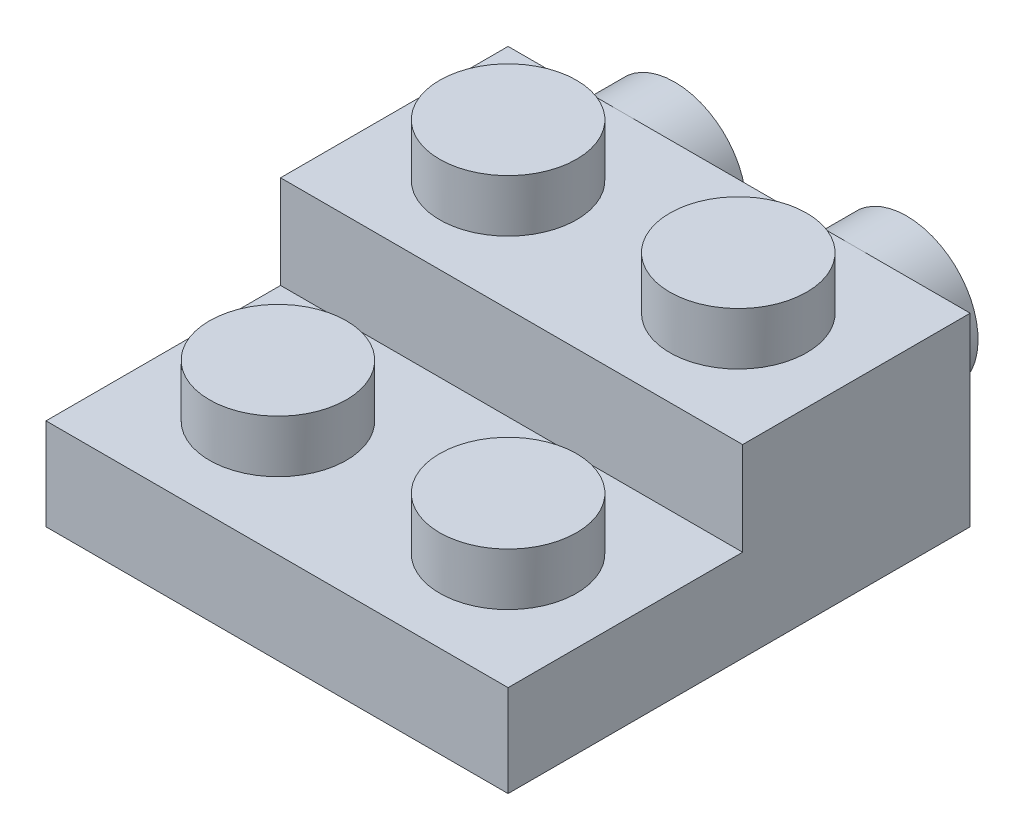
ISO-10303-21;
HEADER;
FILE_DESCRIPTION(('STEP AP214'),'2;1');
FILE_NAME('part.step','',(''),(''),'','','');
FILE_SCHEMA(('AUTOMOTIVE_DESIGN { 1 0 10303 214 1 1 1 1 }'));
ENDSEC;
DATA;
#1=APPLICATION_CONTEXT('core data for automotive mechanical design processes');
#2=APPLICATION_PROTOCOL_DEFINITION('international standard','automotive_design',2000,#1);
#3=PRODUCT_CONTEXT('',#1,'mechanical');
#4=PRODUCT('Part','Part','',(#3));
#5=PRODUCT_RELATED_PRODUCT_CATEGORY('part','',(#4));
#6=PRODUCT_DEFINITION_FORMATION('','',#4);
#7=PRODUCT_DEFINITION_CONTEXT('part definition',#1,'design');
#8=PRODUCT_DEFINITION('design','',#6,#7);
#9=PRODUCT_DEFINITION_SHAPE('','',#8);
#10=(LENGTH_UNIT() NAMED_UNIT(*) SI_UNIT(.MILLI.,.METRE.));
#11=(NAMED_UNIT(*) PLANE_ANGLE_UNIT() SI_UNIT($,.RADIAN.));
#12=(NAMED_UNIT(*) SI_UNIT($,.STERADIAN.) SOLID_ANGLE_UNIT());
#13=UNCERTAINTY_MEASURE_WITH_UNIT(LENGTH_MEASURE(1.E-05),#10,'distance_accuracy_value','');
#14=(GEOMETRIC_REPRESENTATION_CONTEXT(3) GLOBAL_UNCERTAINTY_ASSIGNED_CONTEXT((#13)) GLOBAL_UNIT_ASSIGNED_CONTEXT((#10,
#11,#12)) REPRESENTATION_CONTEXT('',''));
#15=CARTESIAN_POINT('',(0.,0.,0.));
#16=DIRECTION('',(0.,0.,1.));
#17=DIRECTION('',(1.,0.,0.));
#18=AXIS2_PLACEMENT_3D('',#15,#16,#17);
#19=CARTESIAN_POINT('',(15.86,1.75,7.81));
#20=DIRECTION('',(0.,-1.,0.));
#21=DIRECTION('',(0.,0.,-1.));
#22=AXIS2_PLACEMENT_3D('',#19,#20,#21);
#23=PLANE('',#22);
#24=CARTESIAN_POINT('',(7.93,1.75,7.93));
#25=DIRECTION('',(0.,-1.,0.));
#26=DIRECTION('',(0.,0.,-1.));
#27=AXIS2_PLACEMENT_3D('',#24,#25,#26);
#28=CIRCLE('',#27,2.395);
#29=CARTESIAN_POINT('',(9.78084440188796,1.75,6.41));
#30=VERTEX_POINT('',#29);
#31=CARTESIAN_POINT('',(6.07915559811204,1.75,6.41));
#32=VERTEX_POINT('',#31);
#33=EDGE_CURVE('E56',#30,#32,#28,.T.);
#34=ORIENTED_EDGE('',*,*,#33,.T.);
#35=DIRECTION('',(-1.,0.,0.));
#36=VECTOR('',#35,1.);
#37=CARTESIAN_POINT('',(15.86,1.75,6.41));
#38=LINE('',#37,#36);
#39=EDGE_CURVE('E145',#30,#32,#38,.T.);
#40=ORIENTED_EDGE('',*,*,#39,.F.);
#41=EDGE_LOOP('',(#34,#40));
#42=FACE_BOUND('',#41,.T.);
#43=ADVANCED_FACE('F34',(#42),#23,.T.);
#44=CARTESIAN_POINT('',(15.86,0.,15.86));
#45=DIRECTION('',(0.,1.,0.));
#46=DIRECTION('',(0.,0.,1.));
#47=AXIS2_PLACEMENT_3D('',#44,#45,#46);
#48=PLANE('',#47);
#49=DIRECTION('',(0.,0.,-1.));
#50=VECTOR('',#49,1.);
#51=CARTESIAN_POINT('',(0.,0.,15.86));
#52=LINE('',#51,#50);
#53=CARTESIAN_POINT('',(0.,0.,15.86));
#54=VERTEX_POINT('',#53);
#55=CARTESIAN_POINT('',(0.,0.,0.));
#56=VERTEX_POINT('',#55);
#57=EDGE_CURVE('E274',#54,#56,#52,.T.);
#58=ORIENTED_EDGE('',*,*,#57,.T.);
#59=DIRECTION('',(-1.,0.,0.));
#60=VECTOR('',#59,1.);
#61=CARTESIAN_POINT('',(15.86,0.,0.));
#62=LINE('',#61,#60);
#63=CARTESIAN_POINT('',(15.86,0.,0.));
#64=VERTEX_POINT('',#63);
#65=EDGE_CURVE('E316',#64,#56,#62,.T.);
#66=ORIENTED_EDGE('',*,*,#65,.F.);
#67=DIRECTION('',(0.,0.,-1.));
#68=VECTOR('',#67,1.);
#69=CARTESIAN_POINT('',(15.86,0.,15.86));
#70=LINE('',#69,#68);
#71=CARTESIAN_POINT('',(15.86,0.,15.86));
#72=VERTEX_POINT('',#71);
#73=EDGE_CURVE('E275',#72,#64,#70,.T.);
#74=ORIENTED_EDGE('',*,*,#73,.F.);
#75=DIRECTION('',(-1.,0.,0.));
#76=VECTOR('',#75,1.);
#77=CARTESIAN_POINT('',(15.86,0.,15.86));
#78=LINE('',#77,#76);
#79=EDGE_CURVE('E289',#72,#54,#78,.T.);
#80=ORIENTED_EDGE('',*,*,#79,.T.);
#81=EDGE_LOOP('',(#58,#66,#74,#80));
#82=FACE_BOUND('',#81,.T.);
#83=DIRECTION('',(0.,0.,-1.));
#84=VECTOR('',#83,1.);
#85=CARTESIAN_POINT('',(1.4,0.,15.86));
#86=LINE('',#85,#84);
#87=CARTESIAN_POINT('',(1.4,0.,14.46));
#88=VERTEX_POINT('',#87);
#89=CARTESIAN_POINT('',(1.4,0.,1.4));
#90=VERTEX_POINT('',#89);
#91=EDGE_CURVE('E199',#88,#90,#86,.T.);
#92=ORIENTED_EDGE('',*,*,#91,.F.);
#93=DIRECTION('',(-1.,0.,0.));
#94=VECTOR('',#93,1.);
#95=CARTESIAN_POINT('',(15.86,0.,14.46));
#96=LINE('',#95,#94);
#97=CARTESIAN_POINT('',(14.46,0.,14.46));
#98=VERTEX_POINT('',#97);
#99=EDGE_CURVE('E238',#98,#88,#96,.T.);
#100=ORIENTED_EDGE('',*,*,#99,.F.);
#101=DIRECTION('',(0.,0.,-1.));
#102=VECTOR('',#101,1.);
#103=CARTESIAN_POINT('',(14.46,0.,15.86));
#104=LINE('',#103,#102);
#105=CARTESIAN_POINT('',(14.46,0.,1.4));
#106=VERTEX_POINT('',#105);
#107=EDGE_CURVE('E208',#98,#106,#104,.T.);
#108=ORIENTED_EDGE('',*,*,#107,.T.);
#109=DIRECTION('',(-1.,0.,0.));
#110=VECTOR('',#109,1.);
#111=CARTESIAN_POINT('',(15.86,0.,1.4));
#112=LINE('',#111,#110);
#113=EDGE_CURVE('E203',#106,#90,#112,.T.);
#114=ORIENTED_EDGE('',*,*,#113,.T.);
#115=EDGE_LOOP('',(#92,#100,#108,#114));
#116=FACE_BOUND('',#115,.T.);
#117=ADVANCED_FACE('F36',(#82,#116),#48,.F.);
#118=CARTESIAN_POINT('',(15.86,0.,0.));
#119=DIRECTION('',(0.,0.,1.));
#120=DIRECTION('',(1.,0.,0.));
#121=AXIS2_PLACEMENT_3D('',#118,#119,#120);
#122=PLANE('',#121);
#123=DIRECTION('',(-1.,0.,0.));
#124=VECTOR('',#123,1.);
#125=CARTESIAN_POINT('',(15.86,6.35,0.));
#126=LINE('',#125,#124);
#127=CARTESIAN_POINT('',(3.92,6.35,0.));
#128=VERTEX_POINT('',#127);
#129=CARTESIAN_POINT('',(0.,6.35,0.));
#130=VERTEX_POINT('',#129);
#131=EDGE_CURVE('E313',#128,#130,#126,.T.);
#132=ORIENTED_EDGE('',*,*,#131,.F.);
#133=CARTESIAN_POINT('',(3.92,3.9,0.));
#134=DIRECTION('',(0.,0.,-1.));
#135=DIRECTION('',(-1.,0.,0.));
#136=AXIS2_PLACEMENT_3D('',#133,#134,#135);
#137=CIRCLE('',#136,2.45);
#138=EDGE_CURVE('E175',#128,#128,#137,.T.);
#139=ORIENTED_EDGE('',*,*,#138,.F.);
#140=CARTESIAN_POINT('',(11.88,6.35,0.));
#141=VERTEX_POINT('',#140);
#142=EDGE_CURVE('E317',#141,#128,#126,.T.);
#143=ORIENTED_EDGE('',*,*,#142,.F.);
#144=CARTESIAN_POINT('',(11.88,3.9,0.));
#145=DIRECTION('',(0.,0.,-1.));
#146=DIRECTION('',(-1.,0.,0.));
#147=AXIS2_PLACEMENT_3D('',#144,#145,#146);
#148=CIRCLE('',#147,2.45);
#149=EDGE_CURVE('E187',#141,#141,#148,.T.);
#150=ORIENTED_EDGE('',*,*,#149,.F.);
#151=CARTESIAN_POINT('',(15.86,6.35,0.));
#152=VERTEX_POINT('',#151);
#153=EDGE_CURVE('E314',#152,#141,#126,.T.);
#154=ORIENTED_EDGE('',*,*,#153,.F.);
#155=DIRECTION('',(0.,1.,0.));
#156=VECTOR('',#155,1.);
#157=CARTESIAN_POINT('',(15.86,0.,0.));
#158=LINE('',#157,#156);
#159=EDGE_CURVE('E278',#64,#152,#158,.T.);
#160=ORIENTED_EDGE('',*,*,#159,.F.);
#161=ORIENTED_EDGE('',*,*,#65,.T.);
#162=DIRECTION('',(0.,1.,0.));
#163=VECTOR('',#162,1.);
#164=CARTESIAN_POINT('',(0.,0.,0.));
#165=LINE('',#164,#163);
#166=EDGE_CURVE('E292',#56,#130,#165,.T.);
#167=ORIENTED_EDGE('',*,*,#166,.T.);
#168=EDGE_LOOP('',(#132,#139,#143,#150,#154,#160,#161,#167));
#169=FACE_BOUND('',#168,.T.);
#170=ADVANCED_FACE('F367',(#169),#122,.F.);
#171=CARTESIAN_POINT('',(15.86,6.35,0.));
#172=DIRECTION('',(0.,-1.,0.));
#173=DIRECTION('',(0.,0.,-1.));
#174=AXIS2_PLACEMENT_3D('',#171,#172,#173);
#175=PLANE('',#174);
#176=CARTESIAN_POINT('',(11.88,6.35,3.98));
#177=DIRECTION('',(0.,-1.,0.));
#178=DIRECTION('',(0.,0.,-1.));
#179=AXIS2_PLACEMENT_3D('',#176,#177,#178);
#180=CIRCLE('',#179,2.35);
#181=CARTESIAN_POINT('',(11.88,6.35,1.63));
#182=VERTEX_POINT('',#181);
#183=EDGE_CURVE('E323',#182,#182,#180,.F.);
#184=ORIENTED_EDGE('',*,*,#183,.F.);
#185=EDGE_LOOP('',(#184));
#186=FACE_BOUND('',#185,.T.);
#187=CARTESIAN_POINT('',(3.98,6.35,3.98));
#188=DIRECTION('',(0.,-1.,0.));
#189=DIRECTION('',(0.,0.,-1.));
#190=AXIS2_PLACEMENT_3D('',#187,#188,#189);
#191=CIRCLE('',#190,2.35);
#192=CARTESIAN_POINT('',(3.98,6.35,1.63));
#193=VERTEX_POINT('',#192);
#194=EDGE_CURVE('E320',#193,#193,#191,.F.);
#195=ORIENTED_EDGE('',*,*,#194,.F.);
#196=EDGE_LOOP('',(#195));
#197=FACE_BOUND('',#196,.T.);
#198=DIRECTION('',(0.,0.,1.));
#199=VECTOR('',#198,1.);
#200=CARTESIAN_POINT('',(0.,6.35,0.));
#201=LINE('',#200,#199);
#202=CARTESIAN_POINT('',(0.,6.35,7.81));
#203=VERTEX_POINT('',#202);
#204=EDGE_CURVE('E295',#130,#203,#201,.T.);
#205=ORIENTED_EDGE('',*,*,#204,.T.);
#206=DIRECTION('',(-1.,0.,0.));
#207=VECTOR('',#206,1.);
#208=CARTESIAN_POINT('',(15.86,6.35,7.81));
#209=LINE('',#208,#207);
#210=CARTESIAN_POINT('',(15.86,6.35,7.81));
#211=VERTEX_POINT('',#210);
#212=EDGE_CURVE('E310',#211,#203,#209,.T.);
#213=ORIENTED_EDGE('',*,*,#212,.F.);
#214=DIRECTION('',(0.,0.,1.));
#215=VECTOR('',#214,1.);
#216=CARTESIAN_POINT('',(15.86,6.35,0.));
#217=LINE('',#216,#215);
#218=EDGE_CURVE('E281',#152,#211,#217,.T.);
#219=ORIENTED_EDGE('',*,*,#218,.F.);
#220=ORIENTED_EDGE('',*,*,#153,.T.);
#221=ORIENTED_EDGE('',*,*,#142,.T.);
#222=ORIENTED_EDGE('',*,*,#131,.T.);
#223=EDGE_LOOP('',(#205,#213,#219,#220,#221,#222));
#224=FACE_BOUND('',#223,.T.);
#225=ADVANCED_FACE('F362',(#186,#197,#224),#175,.F.);
#226=CARTESIAN_POINT('',(15.86,6.35,7.81));
#227=DIRECTION('',(0.,0.,-1.));
#228=DIRECTION('',(-1.,0.,0.));
#229=AXIS2_PLACEMENT_3D('',#226,#227,#228);
#230=PLANE('',#229);
#231=DIRECTION('',(0.,-1.,0.));
#232=VECTOR('',#231,1.);
#233=CARTESIAN_POINT('',(0.,6.35,7.81));
#234=LINE('',#233,#232);
#235=CARTESIAN_POINT('',(0.,3.15,7.81));
#236=VERTEX_POINT('',#235);
#237=EDGE_CURVE('E297',#203,#236,#234,.T.);
#238=ORIENTED_EDGE('',*,*,#237,.T.);
#239=DIRECTION('',(-1.,0.,0.));
#240=VECTOR('',#239,1.);
#241=CARTESIAN_POINT('',(15.86,3.15,7.81));
#242=LINE('',#241,#240);
#243=CARTESIAN_POINT('',(15.86,3.15,7.81));
#244=VERTEX_POINT('',#243);
#245=EDGE_CURVE('E307',#244,#236,#242,.T.);
#246=ORIENTED_EDGE('',*,*,#245,.F.);
#247=DIRECTION('',(0.,-1.,0.));
#248=VECTOR('',#247,1.);
#249=CARTESIAN_POINT('',(15.86,6.35,7.81));
#250=LINE('',#249,#248);
#251=EDGE_CURVE('E283',#211,#244,#250,.T.);
#252=ORIENTED_EDGE('',*,*,#251,.F.);
#253=ORIENTED_EDGE('',*,*,#212,.T.);
#254=EDGE_LOOP('',(#238,#246,#252,#253));
#255=FACE_BOUND('',#254,.T.);
#256=ADVANCED_FACE('F334',(#255),#230,.F.);
#257=CARTESIAN_POINT('',(15.86,3.15,7.81));
#258=DIRECTION('',(0.,-1.,0.));
#259=DIRECTION('',(0.,0.,-1.));
#260=AXIS2_PLACEMENT_3D('',#257,#258,#259);
#261=PLANE('',#260);
#262=CARTESIAN_POINT('',(11.88,3.15,11.88));
#263=DIRECTION('',(0.,-1.,0.));
#264=DIRECTION('',(0.,0.,-1.));
#265=AXIS2_PLACEMENT_3D('',#262,#263,#264);
#266=CIRCLE('',#265,2.35);
#267=CARTESIAN_POINT('',(11.88,3.15,9.53));
#268=VERTEX_POINT('',#267);
#269=EDGE_CURVE('E12',#268,#268,#266,.F.);
#270=ORIENTED_EDGE('',*,*,#269,.F.);
#271=EDGE_LOOP('',(#270));
#272=FACE_BOUND('',#271,.T.);
#273=CARTESIAN_POINT('',(3.98,3.15,11.88));
#274=DIRECTION('',(0.,-1.,0.));
#275=DIRECTION('',(0.,0.,-1.));
#276=AXIS2_PLACEMENT_3D('',#273,#274,#275);
#277=CIRCLE('',#276,2.35);
#278=CARTESIAN_POINT('',(3.98,3.15,9.53));
#279=VERTEX_POINT('',#278);
#280=EDGE_CURVE('E42',#279,#279,#277,.F.);
#281=ORIENTED_EDGE('',*,*,#280,.F.);
#282=EDGE_LOOP('',(#281));
#283=FACE_BOUND('',#282,.T.);
#284=DIRECTION('',(0.,0.,1.));
#285=VECTOR('',#284,1.);
#286=CARTESIAN_POINT('',(0.,3.15,7.81));
#287=LINE('',#286,#285);
#288=CARTESIAN_POINT('',(0.,3.15,15.86));
#289=VERTEX_POINT('',#288);
#290=EDGE_CURVE('E299',#236,#289,#287,.T.);
#291=ORIENTED_EDGE('',*,*,#290,.T.);
#292=DIRECTION('',(-1.,0.,0.));
#293=VECTOR('',#292,1.);
#294=CARTESIAN_POINT('',(15.86,3.15,15.86));
#295=LINE('',#294,#293);
#296=CARTESIAN_POINT('',(15.86,3.15,15.86));
#297=VERTEX_POINT('',#296);
#298=EDGE_CURVE('E304',#297,#289,#295,.T.);
#299=ORIENTED_EDGE('',*,*,#298,.F.);
#300=DIRECTION('',(0.,0.,1.));
#301=VECTOR('',#300,1.);
#302=CARTESIAN_POINT('',(15.86,3.15,7.81));
#303=LINE('',#302,#301);
#304=EDGE_CURVE('E285',#244,#297,#303,.T.);
#305=ORIENTED_EDGE('',*,*,#304,.F.);
#306=ORIENTED_EDGE('',*,*,#245,.T.);
#307=EDGE_LOOP('',(#291,#299,#305,#306));
#308=FACE_BOUND('',#307,.T.);
#309=ADVANCED_FACE('F330',(#272,#283,#308),#261,.F.);
#310=CARTESIAN_POINT('',(15.86,3.15,15.86));
#311=DIRECTION('',(0.,0.,-1.));
#312=DIRECTION('',(-1.,0.,0.));
#313=AXIS2_PLACEMENT_3D('',#310,#311,#312);
#314=PLANE('',#313);
#315=DIRECTION('',(0.,-1.,0.));
#316=VECTOR('',#315,1.);
#317=CARTESIAN_POINT('',(0.,3.15,15.86));
#318=LINE('',#317,#316);
#319=EDGE_CURVE('E279',#289,#54,#318,.T.);
#320=ORIENTED_EDGE('',*,*,#319,.T.);
#321=ORIENTED_EDGE('',*,*,#79,.F.);
#322=DIRECTION('',(0.,-1.,0.));
#323=VECTOR('',#322,1.);
#324=CARTESIAN_POINT('',(15.86,3.15,15.86));
#325=LINE('',#324,#323);
#326=EDGE_CURVE('E287',#297,#72,#325,.T.);
#327=ORIENTED_EDGE('',*,*,#326,.F.);
#328=ORIENTED_EDGE('',*,*,#298,.T.);
#329=EDGE_LOOP('',(#320,#321,#327,#328));
#330=FACE_BOUND('',#329,.T.);
#331=ADVANCED_FACE('F333',(#330),#314,.F.);
#332=CARTESIAN_POINT('',(15.86,0.,0.));
#333=DIRECTION('',(1.,0.,0.));
#334=DIRECTION('',(0.,0.,-1.));
#335=AXIS2_PLACEMENT_3D('',#332,#333,#334);
#336=PLANE('',#335);
#337=ORIENTED_EDGE('',*,*,#73,.T.);
#338=ORIENTED_EDGE('',*,*,#159,.T.);
#339=ORIENTED_EDGE('',*,*,#218,.T.);
#340=ORIENTED_EDGE('',*,*,#251,.T.);
#341=ORIENTED_EDGE('',*,*,#304,.T.);
#342=ORIENTED_EDGE('',*,*,#326,.T.);
#343=EDGE_LOOP('',(#337,#338,#339,#340,#341,#342));
#344=FACE_BOUND('',#343,.T.);
#345=ADVANCED_FACE('F355',(#344),#336,.T.);
#346=CARTESIAN_POINT('',(0.,0.,0.));
#347=DIRECTION('',(1.,0.,0.));
#348=DIRECTION('',(0.,0.,-1.));
#349=AXIS2_PLACEMENT_3D('',#346,#347,#348);
#350=PLANE('',#349);
#351=ORIENTED_EDGE('',*,*,#57,.F.);
#352=ORIENTED_EDGE('',*,*,#319,.F.);
#353=ORIENTED_EDGE('',*,*,#290,.F.);
#354=ORIENTED_EDGE('',*,*,#237,.F.);
#355=ORIENTED_EDGE('',*,*,#204,.F.);
#356=ORIENTED_EDGE('',*,*,#166,.F.);
#357=EDGE_LOOP('',(#351,#352,#353,#354,#355,#356));
#358=FACE_BOUND('',#357,.T.);
#359=ADVANCED_FACE('F348',(#358),#350,.F.);
#360=CARTESIAN_POINT('',(3.98,8.15,3.98));
#361=DIRECTION('',(0.,-1.,0.));
#362=DIRECTION('',(0.,0.,-1.));
#363=AXIS2_PLACEMENT_3D('',#360,#361,#362);
#364=CYLINDRICAL_SURFACE('',#363,2.35);
#365=CARTESIAN_POINT('',(3.98,8.15,3.98));
#366=DIRECTION('',(0.,1.,0.));
#367=DIRECTION('',(0.,0.,1.));
#368=AXIS2_PLACEMENT_3D('',#365,#366,#367);
#369=CIRCLE('',#368,2.35);
#370=CARTESIAN_POINT('',(3.98,8.15,6.33));
#371=VERTEX_POINT('',#370);
#372=EDGE_CURVE('E271',#371,#371,#369,.T.);
#373=ORIENTED_EDGE('',*,*,#372,.F.);
#374=EDGE_LOOP('',(#373));
#375=FACE_BOUND('',#374,.T.);
#376=ORIENTED_EDGE('',*,*,#194,.T.);
#377=EDGE_LOOP('',(#376));
#378=FACE_BOUND('',#377,.T.);
#379=ADVANCED_FACE('F463',(#375,#378),#364,.T.);
#380=CARTESIAN_POINT('',(3.98,8.15,3.98));
#381=DIRECTION('',(0.,1.,0.));
#382=DIRECTION('',(0.,0.,1.));
#383=AXIS2_PLACEMENT_3D('',#380,#381,#382);
#384=PLANE('',#383);
#385=ORIENTED_EDGE('',*,*,#372,.T.);
#386=EDGE_LOOP('',(#385));
#387=FACE_BOUND('',#386,.T.);
#388=ADVANCED_FACE('F459',(#387),#384,.T.);
#389=CARTESIAN_POINT('',(11.88,8.15,3.98));
#390=DIRECTION('',(0.,-1.,0.));
#391=DIRECTION('',(0.,0.,-1.));
#392=AXIS2_PLACEMENT_3D('',#389,#390,#391);
#393=CYLINDRICAL_SURFACE('',#392,2.35);
#394=CARTESIAN_POINT('',(11.88,8.15,3.98));
#395=DIRECTION('',(0.,1.,0.));
#396=DIRECTION('',(0.,0.,1.));
#397=AXIS2_PLACEMENT_3D('',#394,#395,#396);
#398=CIRCLE('',#397,2.35);
#399=CARTESIAN_POINT('',(11.88,8.15,6.33));
#400=VERTEX_POINT('',#399);
#401=EDGE_CURVE('E268',#400,#400,#398,.T.);
#402=ORIENTED_EDGE('',*,*,#401,.F.);
#403=EDGE_LOOP('',(#402));
#404=FACE_BOUND('',#403,.T.);
#405=ORIENTED_EDGE('',*,*,#183,.T.);
#406=EDGE_LOOP('',(#405));
#407=FACE_BOUND('',#406,.T.);
#408=ADVANCED_FACE('F455',(#404,#407),#393,.T.);
#409=CARTESIAN_POINT('',(11.88,8.15,3.98));
#410=DIRECTION('',(0.,1.,0.));
#411=DIRECTION('',(0.,0.,1.));
#412=AXIS2_PLACEMENT_3D('',#409,#410,#411);
#413=PLANE('',#412);
#414=ORIENTED_EDGE('',*,*,#401,.T.);
#415=EDGE_LOOP('',(#414));
#416=FACE_BOUND('',#415,.T.);
#417=ADVANCED_FACE('F451',(#416),#413,.T.);
#418=CARTESIAN_POINT('',(3.98,4.95,11.88));
#419=DIRECTION('',(0.,-1.,0.));
#420=DIRECTION('',(0.,0.,-1.));
#421=AXIS2_PLACEMENT_3D('',#418,#419,#420);
#422=CYLINDRICAL_SURFACE('',#421,2.35);
#423=CARTESIAN_POINT('',(3.98,4.95,11.88));
#424=DIRECTION('',(0.,1.,0.));
#425=DIRECTION('',(0.,0.,1.));
#426=AXIS2_PLACEMENT_3D('',#423,#424,#425);
#427=CIRCLE('',#426,2.35);
#428=CARTESIAN_POINT('',(3.98,4.95,14.23));
#429=VERTEX_POINT('',#428);
#430=EDGE_CURVE('E265',#429,#429,#427,.T.);
#431=ORIENTED_EDGE('',*,*,#430,.F.);
#432=EDGE_LOOP('',(#431));
#433=FACE_BOUND('',#432,.T.);
#434=ORIENTED_EDGE('',*,*,#280,.T.);
#435=EDGE_LOOP('',(#434));
#436=FACE_BOUND('',#435,.T.);
#437=ADVANCED_FACE('F328',(#433,#436),#422,.T.);
#438=CARTESIAN_POINT('',(3.98,4.95,11.88));
#439=DIRECTION('',(0.,1.,0.));
#440=DIRECTION('',(0.,0.,1.));
#441=AXIS2_PLACEMENT_3D('',#438,#439,#440);
#442=PLANE('',#441);
#443=ORIENTED_EDGE('',*,*,#430,.T.);
#444=EDGE_LOOP('',(#443));
#445=FACE_BOUND('',#444,.T.);
#446=ADVANCED_FACE('F444',(#445),#442,.T.);
#447=CARTESIAN_POINT('',(11.88,4.95,11.88));
#448=DIRECTION('',(0.,-1.,0.));
#449=DIRECTION('',(0.,0.,-1.));
#450=AXIS2_PLACEMENT_3D('',#447,#448,#449);
#451=CYLINDRICAL_SURFACE('',#450,2.35);
#452=CARTESIAN_POINT('',(11.88,4.95,11.88));
#453=DIRECTION('',(0.,1.,0.));
#454=DIRECTION('',(0.,0.,1.));
#455=AXIS2_PLACEMENT_3D('',#452,#453,#454);
#456=CIRCLE('',#455,2.35);
#457=CARTESIAN_POINT('',(11.88,4.95,14.23));
#458=VERTEX_POINT('',#457);
#459=EDGE_CURVE('E230',#458,#458,#456,.T.);
#460=ORIENTED_EDGE('',*,*,#459,.F.);
#461=EDGE_LOOP('',(#460));
#462=FACE_BOUND('',#461,.T.);
#463=ORIENTED_EDGE('',*,*,#269,.T.);
#464=EDGE_LOOP('',(#463));
#465=FACE_BOUND('',#464,.T.);
#466=ADVANCED_FACE('F440',(#462,#465),#451,.T.);
#467=CARTESIAN_POINT('',(11.88,4.95,11.88));
#468=DIRECTION('',(0.,1.,0.));
#469=DIRECTION('',(0.,0.,1.));
#470=AXIS2_PLACEMENT_3D('',#467,#468,#469);
#471=PLANE('',#470);
#472=ORIENTED_EDGE('',*,*,#459,.T.);
#473=EDGE_LOOP('',(#472));
#474=FACE_BOUND('',#473,.T.);
#475=ADVANCED_FACE('F436',(#474),#471,.T.);
#476=CARTESIAN_POINT('',(15.86,0.,1.4));
#477=DIRECTION('',(0.,0.,1.));
#478=DIRECTION('',(1.,0.,0.));
#479=AXIS2_PLACEMENT_3D('',#476,#477,#478);
#480=PLANE('',#479);
#481=DIRECTION('',(0.,1.,0.));
#482=VECTOR('',#481,1.);
#483=CARTESIAN_POINT('',(1.4,0.,1.4));
#484=LINE('',#483,#482);
#485=CARTESIAN_POINT('',(1.4,4.95,1.4));
#486=VERTEX_POINT('',#485);
#487=EDGE_CURVE('E196',#90,#486,#484,.T.);
#488=ORIENTED_EDGE('',*,*,#487,.F.);
#489=ORIENTED_EDGE('',*,*,#113,.F.);
#490=DIRECTION('',(0.,1.,0.));
#491=VECTOR('',#490,1.);
#492=CARTESIAN_POINT('',(14.46,0.,1.4));
#493=LINE('',#492,#491);
#494=CARTESIAN_POINT('',(14.46,4.95,1.4));
#495=VERTEX_POINT('',#494);
#496=EDGE_CURVE('E205',#106,#495,#493,.T.);
#497=ORIENTED_EDGE('',*,*,#496,.T.);
#498=DIRECTION('',(-1.,0.,0.));
#499=VECTOR('',#498,1.);
#500=CARTESIAN_POINT('',(15.86,4.95,1.4));
#501=LINE('',#500,#499);
#502=EDGE_CURVE('E200',#495,#486,#501,.T.);
#503=ORIENTED_EDGE('',*,*,#502,.T.);
#504=EDGE_LOOP('',(#488,#489,#497,#503));
#505=FACE_BOUND('',#504,.T.);
#506=ADVANCED_FACE('F439',(#505),#480,.T.);
#507=CARTESIAN_POINT('',(15.86,4.95,0.));
#508=DIRECTION('',(0.,-1.,0.));
#509=DIRECTION('',(0.,0.,-1.));
#510=AXIS2_PLACEMENT_3D('',#507,#508,#509);
#511=PLANE('',#510);
#512=CARTESIAN_POINT('',(11.88,4.95,3.98));
#513=DIRECTION('',(0.,-1.,0.));
#514=DIRECTION('',(0.,0.,-1.));
#515=AXIS2_PLACEMENT_3D('',#512,#513,#514);
#516=CIRCLE('',#515,0.95);
#517=CARTESIAN_POINT('',(11.88,4.95,3.03));
#518=VERTEX_POINT('',#517);
#519=EDGE_CURVE('E209',#518,#518,#516,.F.);
#520=ORIENTED_EDGE('',*,*,#519,.T.);
#521=EDGE_LOOP('',(#520));
#522=FACE_BOUND('',#521,.T.);
#523=CARTESIAN_POINT('',(3.98,4.95,3.98));
#524=DIRECTION('',(0.,-1.,0.));
#525=DIRECTION('',(0.,0.,-1.));
#526=AXIS2_PLACEMENT_3D('',#523,#524,#525);
#527=CIRCLE('',#526,0.950000000000001);
#528=CARTESIAN_POINT('',(3.98,4.95,3.03));
#529=VERTEX_POINT('',#528);
#530=EDGE_CURVE('E213',#529,#529,#527,.F.);
#531=ORIENTED_EDGE('',*,*,#530,.T.);
#532=EDGE_LOOP('',(#531));
#533=FACE_BOUND('',#532,.T.);
#534=DIRECTION('',(0.,0.,1.));
#535=VECTOR('',#534,1.);
#536=CARTESIAN_POINT('',(1.4,4.95,0.));
#537=LINE('',#536,#535);
#538=CARTESIAN_POINT('',(1.4,4.95,6.41));
#539=VERTEX_POINT('',#538);
#540=EDGE_CURVE('E198',#486,#539,#537,.T.);
#541=ORIENTED_EDGE('',*,*,#540,.F.);
#542=ORIENTED_EDGE('',*,*,#502,.F.);
#543=DIRECTION('',(0.,0.,1.));
#544=VECTOR('',#543,1.);
#545=CARTESIAN_POINT('',(14.46,4.95,0.));
#546=LINE('',#545,#544);
#547=CARTESIAN_POINT('',(14.46,4.95,6.41));
#548=VERTEX_POINT('',#547);
#549=EDGE_CURVE('E207',#495,#548,#546,.T.);
#550=ORIENTED_EDGE('',*,*,#549,.T.);
#551=DIRECTION('',(-1.,0.,0.));
#552=VECTOR('',#551,1.);
#553=CARTESIAN_POINT('',(15.86,4.95,6.41));
#554=LINE('',#553,#552);
#555=EDGE_CURVE('E204',#548,#539,#554,.T.);
#556=ORIENTED_EDGE('',*,*,#555,.T.);
#557=EDGE_LOOP('',(#541,#542,#550,#556));
#558=FACE_BOUND('',#557,.T.);
#559=ADVANCED_FACE('F405',(#522,#533,#558),#511,.T.);
#560=CARTESIAN_POINT('',(15.86,6.35,6.41));
#561=DIRECTION('',(0.,0.,-1.));
#562=DIRECTION('',(-1.,0.,0.));
#563=AXIS2_PLACEMENT_3D('',#560,#561,#562);
#564=PLANE('',#563);
#565=DIRECTION('',(0.,-1.,0.));
#566=VECTOR('',#565,1.);
#567=CARTESIAN_POINT('',(1.4,6.35,6.41));
#568=LINE('',#567,#566);
#569=CARTESIAN_POINT('',(1.4,1.75,6.41));
#570=VERTEX_POINT('',#569);
#571=EDGE_CURVE('E217',#539,#570,#568,.T.);
#572=ORIENTED_EDGE('',*,*,#571,.F.);
#573=ORIENTED_EDGE('',*,*,#555,.F.);
#574=DIRECTION('',(0.,-1.,0.));
#575=VECTOR('',#574,1.);
#576=CARTESIAN_POINT('',(14.46,6.35,6.41));
#577=LINE('',#576,#575);
#578=CARTESIAN_POINT('',(14.46,1.75,6.41));
#579=VERTEX_POINT('',#578);
#580=EDGE_CURVE('E221',#548,#579,#577,.T.);
#581=ORIENTED_EDGE('',*,*,#580,.T.);
#582=CARTESIAN_POINT('',(10.5742579299304,1.75,6.41));
#583=VERTEX_POINT('',#582);
#584=EDGE_CURVE('E148',#579,#583,#38,.T.);
#585=ORIENTED_EDGE('',*,*,#584,.T.);
#586=EDGE_CURVE('E142',#583,#30,#38,.T.);
#587=ORIENTED_EDGE('',*,*,#586,.T.);
#588=ORIENTED_EDGE('',*,*,#39,.T.);
#589=CARTESIAN_POINT('',(5.28574207006956,1.75,6.41));
#590=VERTEX_POINT('',#589);
#591=EDGE_CURVE('E154',#32,#590,#38,.T.);
#592=ORIENTED_EDGE('',*,*,#591,.T.);
#593=EDGE_CURVE('E49',#590,#570,#38,.T.);
#594=ORIENTED_EDGE('',*,*,#593,.T.);
#595=EDGE_LOOP('',(#572,#573,#581,#585,#587,#588,#592,#594));
#596=FACE_BOUND('',#595,.T.);
#597=ADVANCED_FACE('F144',(#596),#564,.T.);
#598=CARTESIAN_POINT('',(11.88,1.75,11.88));
#599=DIRECTION('',(0.,-1.,0.));
#600=DIRECTION('',(0.,0.,-1.));
#601=AXIS2_PLACEMENT_3D('',#598,#599,#600);
#602=CIRCLE('',#601,0.95);
#603=CARTESIAN_POINT('',(11.88,1.75,10.93));
#604=VERTEX_POINT('',#603);
#605=EDGE_CURVE('E227',#604,#604,#602,.F.);
#606=ORIENTED_EDGE('',*,*,#605,.T.);
#607=EDGE_LOOP('',(#606));
#608=FACE_BOUND('',#607,.T.);
#609=CARTESIAN_POINT('',(3.98,1.75,11.88));
#610=DIRECTION('',(0.,-1.,0.));
#611=DIRECTION('',(0.,0.,-1.));
#612=AXIS2_PLACEMENT_3D('',#609,#610,#611);
#613=CIRCLE('',#612,0.95);
#614=CARTESIAN_POINT('',(3.98,1.75,10.93));
#615=VERTEX_POINT('',#614);
#616=EDGE_CURVE('E212',#615,#615,#613,.F.);
#617=ORIENTED_EDGE('',*,*,#616,.T.);
#618=EDGE_LOOP('',(#617));
#619=FACE_BOUND('',#618,.T.);
#620=ORIENTED_EDGE('',*,*,#593,.F.);
#621=CARTESIAN_POINT('',(7.93,1.75,7.93));
#622=DIRECTION('',(0.,-1.,0.));
#623=DIRECTION('',(0.,0.,-1.));
#624=AXIS2_PLACEMENT_3D('',#621,#622,#623);
#625=CIRCLE('',#624,3.05);
#626=EDGE_CURVE('E166',#583,#590,#625,.T.);
#627=ORIENTED_EDGE('',*,*,#626,.F.);
#628=ORIENTED_EDGE('',*,*,#584,.F.);
#629=DIRECTION('',(0.,0.,1.));
#630=VECTOR('',#629,1.);
#631=CARTESIAN_POINT('',(14.46,1.75,7.81));
#632=LINE('',#631,#630);
#633=CARTESIAN_POINT('',(14.46,1.75,14.46));
#634=VERTEX_POINT('',#633);
#635=EDGE_CURVE('E226',#579,#634,#632,.T.);
#636=ORIENTED_EDGE('',*,*,#635,.T.);
#637=DIRECTION('',(-1.,0.,0.));
#638=VECTOR('',#637,1.);
#639=CARTESIAN_POINT('',(15.86,1.75,14.46));
#640=LINE('',#639,#638);
#641=CARTESIAN_POINT('',(1.4,1.75,14.46));
#642=VERTEX_POINT('',#641);
#643=EDGE_CURVE('E235',#634,#642,#640,.T.);
#644=ORIENTED_EDGE('',*,*,#643,.T.);
#645=DIRECTION('',(0.,0.,1.));
#646=VECTOR('',#645,1.);
#647=CARTESIAN_POINT('',(1.4,1.75,7.81));
#648=LINE('',#647,#646);
#649=EDGE_CURVE('E223',#570,#642,#648,.T.);
#650=ORIENTED_EDGE('',*,*,#649,.F.);
#651=EDGE_LOOP('',(#620,#627,#628,#636,#644,#650));
#652=FACE_BOUND('',#651,.T.);
#653=ADVANCED_FACE('F390',(#608,#619,#652),#23,.T.);
#654=CARTESIAN_POINT('',(15.86,3.15,14.46));
#655=DIRECTION('',(0.,0.,-1.));
#656=DIRECTION('',(-1.,0.,0.));
#657=AXIS2_PLACEMENT_3D('',#654,#655,#656);
#658=PLANE('',#657);
#659=DIRECTION('',(0.,-1.,0.));
#660=VECTOR('',#659,1.);
#661=CARTESIAN_POINT('',(1.4,3.15,14.46));
#662=LINE('',#661,#660);
#663=EDGE_CURVE('E234',#642,#88,#662,.T.);
#664=ORIENTED_EDGE('',*,*,#663,.F.);
#665=ORIENTED_EDGE('',*,*,#643,.F.);
#666=DIRECTION('',(0.,-1.,0.));
#667=VECTOR('',#666,1.);
#668=CARTESIAN_POINT('',(14.46,3.15,14.46));
#669=LINE('',#668,#667);
#670=EDGE_CURVE('E240',#634,#98,#669,.T.);
#671=ORIENTED_EDGE('',*,*,#670,.T.);
#672=ORIENTED_EDGE('',*,*,#99,.T.);
#673=EDGE_LOOP('',(#664,#665,#671,#672));
#674=FACE_BOUND('',#673,.T.);
#675=ADVANCED_FACE('F397',(#674),#658,.T.);
#676=CARTESIAN_POINT('',(14.46,0.,0.));
#677=DIRECTION('',(1.,0.,0.));
#678=DIRECTION('',(0.,0.,-1.));
#679=AXIS2_PLACEMENT_3D('',#676,#677,#678);
#680=PLANE('',#679);
#681=ORIENTED_EDGE('',*,*,#107,.F.);
#682=ORIENTED_EDGE('',*,*,#670,.F.);
#683=ORIENTED_EDGE('',*,*,#635,.F.);
#684=ORIENTED_EDGE('',*,*,#580,.F.);
#685=ORIENTED_EDGE('',*,*,#549,.F.);
#686=ORIENTED_EDGE('',*,*,#496,.F.);
#687=EDGE_LOOP('',(#681,#682,#683,#684,#685,#686));
#688=FACE_BOUND('',#687,.T.);
#689=ADVANCED_FACE('F403',(#688),#680,.F.);
#690=CARTESIAN_POINT('',(1.4,0.,0.));
#691=DIRECTION('',(1.,0.,0.));
#692=DIRECTION('',(0.,0.,-1.));
#693=AXIS2_PLACEMENT_3D('',#690,#691,#692);
#694=PLANE('',#693);
#695=ORIENTED_EDGE('',*,*,#91,.T.);
#696=ORIENTED_EDGE('',*,*,#487,.T.);
#697=ORIENTED_EDGE('',*,*,#540,.T.);
#698=ORIENTED_EDGE('',*,*,#571,.T.);
#699=ORIENTED_EDGE('',*,*,#649,.T.);
#700=ORIENTED_EDGE('',*,*,#663,.T.);
#701=EDGE_LOOP('',(#695,#696,#697,#698,#699,#700));
#702=FACE_BOUND('',#701,.T.);
#703=ADVANCED_FACE('F518',(#702),#694,.T.);
#704=CARTESIAN_POINT('',(3.98,8.15,3.98));
#705=DIRECTION('',(0.,-1.,0.));
#706=DIRECTION('',(0.,0.,-1.));
#707=AXIS2_PLACEMENT_3D('',#704,#705,#706);
#708=CYLINDRICAL_SURFACE('',#707,0.950000000000001);
#709=CARTESIAN_POINT('',(3.98,6.75,3.98));
#710=DIRECTION('',(0.,1.,0.));
#711=DIRECTION('',(0.,0.,1.));
#712=AXIS2_PLACEMENT_3D('',#709,#710,#711);
#713=CIRCLE('',#712,0.950000000000001);
#714=CARTESIAN_POINT('',(3.98,6.75,4.93));
#715=VERTEX_POINT('',#714);
#716=EDGE_CURVE('E250',#715,#715,#713,.T.);
#717=ORIENTED_EDGE('',*,*,#716,.T.);
#718=EDGE_LOOP('',(#717));
#719=FACE_BOUND('',#718,.T.);
#720=ORIENTED_EDGE('',*,*,#530,.F.);
#721=EDGE_LOOP('',(#720));
#722=FACE_BOUND('',#721,.T.);
#723=ADVANCED_FACE('F679',(#719,#722),#708,.F.);
#724=CARTESIAN_POINT('',(3.98,6.75,3.98));
#725=DIRECTION('',(0.,1.,0.));
#726=DIRECTION('',(0.,0.,1.));
#727=AXIS2_PLACEMENT_3D('',#724,#725,#726);
#728=PLANE('',#727);
#729=ORIENTED_EDGE('',*,*,#716,.F.);
#730=EDGE_LOOP('',(#729));
#731=FACE_BOUND('',#730,.T.);
#732=ADVANCED_FACE('F670',(#731),#728,.F.);
#733=CARTESIAN_POINT('',(11.88,8.15,3.98));
#734=DIRECTION('',(0.,-1.,0.));
#735=DIRECTION('',(0.,0.,-1.));
#736=AXIS2_PLACEMENT_3D('',#733,#734,#735);
#737=CYLINDRICAL_SURFACE('',#736,0.95);
#738=CARTESIAN_POINT('',(11.88,6.75,3.98));
#739=DIRECTION('',(0.,1.,0.));
#740=DIRECTION('',(0.,0.,1.));
#741=AXIS2_PLACEMENT_3D('',#738,#739,#740);
#742=CIRCLE('',#741,0.95);
#743=CARTESIAN_POINT('',(11.88,6.75,4.93));
#744=VERTEX_POINT('',#743);
#745=EDGE_CURVE('E247',#744,#744,#742,.T.);
#746=ORIENTED_EDGE('',*,*,#745,.T.);
#747=EDGE_LOOP('',(#746));
#748=FACE_BOUND('',#747,.T.);
#749=ORIENTED_EDGE('',*,*,#519,.F.);
#750=EDGE_LOOP('',(#749));
#751=FACE_BOUND('',#750,.T.);
#752=ADVANCED_FACE('F423',(#748,#751),#737,.F.);
#753=CARTESIAN_POINT('',(11.88,6.75,3.98));
#754=DIRECTION('',(0.,1.,0.));
#755=DIRECTION('',(0.,0.,1.));
#756=AXIS2_PLACEMENT_3D('',#753,#754,#755);
#757=PLANE('',#756);
#758=ORIENTED_EDGE('',*,*,#745,.F.);
#759=EDGE_LOOP('',(#758));
#760=FACE_BOUND('',#759,.T.);
#761=ADVANCED_FACE('F413',(#760),#757,.F.);
#762=CARTESIAN_POINT('',(3.98,4.95,11.88));
#763=DIRECTION('',(0.,-1.,0.));
#764=DIRECTION('',(0.,0.,-1.));
#765=AXIS2_PLACEMENT_3D('',#762,#763,#764);
#766=CYLINDRICAL_SURFACE('',#765,0.95);
#767=CARTESIAN_POINT('',(3.98,3.55,11.88));
#768=DIRECTION('',(0.,1.,0.));
#769=DIRECTION('',(0.,0.,1.));
#770=AXIS2_PLACEMENT_3D('',#767,#768,#769);
#771=CIRCLE('',#770,0.95);
#772=CARTESIAN_POINT('',(3.98,3.55,12.83));
#773=VERTEX_POINT('',#772);
#774=EDGE_CURVE('E244',#773,#773,#771,.T.);
#775=ORIENTED_EDGE('',*,*,#774,.T.);
#776=EDGE_LOOP('',(#775));
#777=FACE_BOUND('',#776,.T.);
#778=ORIENTED_EDGE('',*,*,#616,.F.);
#779=EDGE_LOOP('',(#778));
#780=FACE_BOUND('',#779,.T.);
#781=ADVANCED_FACE('F410',(#777,#780),#766,.F.);
#782=CARTESIAN_POINT('',(3.98,3.55,11.88));
#783=DIRECTION('',(0.,1.,0.));
#784=DIRECTION('',(0.,0.,1.));
#785=AXIS2_PLACEMENT_3D('',#782,#783,#784);
#786=PLANE('',#785);
#787=ORIENTED_EDGE('',*,*,#774,.F.);
#788=EDGE_LOOP('',(#787));
#789=FACE_BOUND('',#788,.T.);
#790=ADVANCED_FACE('F412',(#789),#786,.F.);
#791=CARTESIAN_POINT('',(11.88,4.95,11.88));
#792=DIRECTION('',(0.,-1.,0.));
#793=DIRECTION('',(0.,0.,-1.));
#794=AXIS2_PLACEMENT_3D('',#791,#792,#793);
#795=CYLINDRICAL_SURFACE('',#794,0.95);
#796=CARTESIAN_POINT('',(11.88,3.55,11.88));
#797=DIRECTION('',(0.,1.,0.));
#798=DIRECTION('',(0.,0.,1.));
#799=AXIS2_PLACEMENT_3D('',#796,#797,#798);
#800=CIRCLE('',#799,0.95);
#801=CARTESIAN_POINT('',(11.88,3.55,12.83));
#802=VERTEX_POINT('',#801);
#803=EDGE_CURVE('E193',#802,#802,#800,.T.);
#804=ORIENTED_EDGE('',*,*,#803,.T.);
#805=EDGE_LOOP('',(#804));
#806=FACE_BOUND('',#805,.T.);
#807=ORIENTED_EDGE('',*,*,#605,.F.);
#808=EDGE_LOOP('',(#807));
#809=FACE_BOUND('',#808,.T.);
#810=ADVANCED_FACE('F420',(#806,#809),#795,.F.);
#811=CARTESIAN_POINT('',(11.88,3.55,11.88));
#812=DIRECTION('',(0.,1.,0.));
#813=DIRECTION('',(0.,0.,1.));
#814=AXIS2_PLACEMENT_3D('',#811,#812,#813);
#815=PLANE('',#814);
#816=ORIENTED_EDGE('',*,*,#803,.F.);
#817=EDGE_LOOP('',(#816));
#818=FACE_BOUND('',#817,.T.);
#819=ADVANCED_FACE('F430',(#818),#815,.F.);
#820=CARTESIAN_POINT('',(11.88,3.9,-1.8));
#821=DIRECTION('',(0.,0.,-1.));
#822=DIRECTION('',(-1.,0.,0.));
#823=AXIS2_PLACEMENT_3D('',#820,#821,#822);
#824=PLANE('',#823);
#825=CARTESIAN_POINT('',(11.88,3.9,-1.8));
#826=DIRECTION('',(0.,0.,-1.));
#827=DIRECTION('',(-1.,0.,0.));
#828=AXIS2_PLACEMENT_3D('',#825,#826,#827);
#829=CIRCLE('',#828,2.45);
#830=CARTESIAN_POINT('',(9.43,3.9,-1.8));
#831=VERTEX_POINT('',#830);
#832=EDGE_CURVE('E190',#831,#831,#829,.T.);
#833=ORIENTED_EDGE('',*,*,#832,.T.);
#834=EDGE_LOOP('',(#833));
#835=FACE_BOUND('',#834,.T.);
#836=CARTESIAN_POINT('',(11.88,3.9,-1.8));
#837=DIRECTION('',(0.,0.,-1.));
#838=DIRECTION('',(-1.,0.,0.));
#839=AXIS2_PLACEMENT_3D('',#836,#837,#838);
#840=CIRCLE('',#839,1.45);
#841=CARTESIAN_POINT('',(10.43,3.9,-1.8));
#842=VERTEX_POINT('',#841);
#843=EDGE_CURVE('E184',#842,#842,#840,.T.);
#844=ORIENTED_EDGE('',*,*,#843,.F.);
#845=EDGE_LOOP('',(#844));
#846=FACE_BOUND('',#845,.T.);
#847=ADVANCED_FACE('F434',(#835,#846),#824,.T.);
#848=CARTESIAN_POINT('',(11.88,3.9,-1.8));
#849=DIRECTION('',(0.,0.,1.));
#850=DIRECTION('',(1.,0.,0.));
#851=AXIS2_PLACEMENT_3D('',#848,#849,#850);
#852=CYLINDRICAL_SURFACE('',#851,2.45);
#853=ORIENTED_EDGE('',*,*,#832,.F.);
#854=EDGE_LOOP('',(#853));
#855=FACE_BOUND('',#854,.T.);
#856=ORIENTED_EDGE('',*,*,#149,.T.);
#857=EDGE_LOOP('',(#856));
#858=FACE_BOUND('',#857,.T.);
#859=ADVANCED_FACE('F489',(#855,#858),#852,.T.);
#860=CARTESIAN_POINT('',(11.88,3.9,-1.8));
#861=DIRECTION('',(0.,0.,1.));
#862=DIRECTION('',(1.,0.,0.));
#863=AXIS2_PLACEMENT_3D('',#860,#861,#862);
#864=CYLINDRICAL_SURFACE('',#863,1.45);
#865=ORIENTED_EDGE('',*,*,#843,.T.);
#866=EDGE_LOOP('',(#865));
#867=FACE_BOUND('',#866,.T.);
#868=CARTESIAN_POINT('',(11.88,3.9,0.));
#869=DIRECTION('',(0.,0.,-1.));
#870=DIRECTION('',(-1.,0.,0.));
#871=AXIS2_PLACEMENT_3D('',#868,#869,#870);
#872=CIRCLE('',#871,1.45);
#873=CARTESIAN_POINT('',(10.43,3.9,0.));
#874=VERTEX_POINT('',#873);
#875=EDGE_CURVE('E181',#874,#874,#872,.T.);
#876=ORIENTED_EDGE('',*,*,#875,.F.);
#877=EDGE_LOOP('',(#876));
#878=FACE_BOUND('',#877,.T.);
#879=ADVANCED_FACE('F484',(#867,#878),#864,.F.);
#880=ORIENTED_EDGE('',*,*,#875,.T.);
#881=EDGE_LOOP('',(#880));
#882=FACE_BOUND('',#881,.T.);
#883=ADVANCED_FACE('F383',(#882),#122,.F.);
#884=CARTESIAN_POINT('',(3.92,3.9,-1.8));
#885=DIRECTION('',(0.,0.,-1.));
#886=DIRECTION('',(-1.,0.,0.));
#887=AXIS2_PLACEMENT_3D('',#884,#885,#886);
#888=PLANE('',#887);
#889=CARTESIAN_POINT('',(3.92,3.9,-1.8));
#890=DIRECTION('',(0.,0.,-1.));
#891=DIRECTION('',(-1.,0.,0.));
#892=AXIS2_PLACEMENT_3D('',#889,#890,#891);
#893=CIRCLE('',#892,2.45);
#894=CARTESIAN_POINT('',(1.47,3.9,-1.8));
#895=VERTEX_POINT('',#894);
#896=EDGE_CURVE('E178',#895,#895,#893,.T.);
#897=ORIENTED_EDGE('',*,*,#896,.T.);
#898=EDGE_LOOP('',(#897));
#899=FACE_BOUND('',#898,.T.);
#900=CARTESIAN_POINT('',(3.92,3.9,-1.8));
#901=DIRECTION('',(0.,0.,-1.));
#902=DIRECTION('',(-1.,0.,0.));
#903=AXIS2_PLACEMENT_3D('',#900,#901,#902);
#904=CIRCLE('',#903,1.45);
#905=CARTESIAN_POINT('',(2.47,3.9,-1.8));
#906=VERTEX_POINT('',#905);
#907=EDGE_CURVE('E172',#906,#906,#904,.T.);
#908=ORIENTED_EDGE('',*,*,#907,.F.);
#909=EDGE_LOOP('',(#908));
#910=FACE_BOUND('',#909,.T.);
#911=ADVANCED_FACE('F373',(#899,#910),#888,.T.);
#912=CARTESIAN_POINT('',(3.92,3.9,-1.8));
#913=DIRECTION('',(0.,0.,1.));
#914=DIRECTION('',(1.,0.,0.));
#915=AXIS2_PLACEMENT_3D('',#912,#913,#914);
#916=CYLINDRICAL_SURFACE('',#915,2.45);
#917=ORIENTED_EDGE('',*,*,#896,.F.);
#918=EDGE_LOOP('',(#917));
#919=FACE_BOUND('',#918,.T.);
#920=ORIENTED_EDGE('',*,*,#138,.T.);
#921=EDGE_LOOP('',(#920));
#922=FACE_BOUND('',#921,.T.);
#923=ADVANCED_FACE('F370',(#919,#922),#916,.T.);
#924=CARTESIAN_POINT('',(3.92,3.9,-1.8));
#925=DIRECTION('',(0.,0.,1.));
#926=DIRECTION('',(1.,0.,0.));
#927=AXIS2_PLACEMENT_3D('',#924,#925,#926);
#928=CYLINDRICAL_SURFACE('',#927,1.45);
#929=ORIENTED_EDGE('',*,*,#907,.T.);
#930=EDGE_LOOP('',(#929));
#931=FACE_BOUND('',#930,.T.);
#932=CARTESIAN_POINT('',(3.92,3.9,0.));
#933=DIRECTION('',(0.,0.,-1.));
#934=DIRECTION('',(-1.,0.,0.));
#935=AXIS2_PLACEMENT_3D('',#932,#933,#934);
#936=CIRCLE('',#935,1.45);
#937=CARTESIAN_POINT('',(2.47,3.9,0.));
#938=VERTEX_POINT('',#937);
#939=EDGE_CURVE('E171',#938,#938,#936,.T.);
#940=ORIENTED_EDGE('',*,*,#939,.F.);
#941=EDGE_LOOP('',(#940));
#942=FACE_BOUND('',#941,.T.);
#943=ADVANCED_FACE('F372',(#931,#942),#928,.F.);
#944=ORIENTED_EDGE('',*,*,#939,.T.);
#945=EDGE_LOOP('',(#944));
#946=FACE_BOUND('',#945,.T.);
#947=ADVANCED_FACE('F380',(#946),#122,.F.);
#948=CARTESIAN_POINT('',(7.93,1.75,7.93));
#949=DIRECTION('',(0.,-1.,0.));
#950=DIRECTION('',(0.,0.,-1.));
#951=AXIS2_PLACEMENT_3D('',#948,#949,#950);
#952=PLANE('',#951);
#953=ORIENTED_EDGE('',*,*,#586,.F.);
#954=EDGE_CURVE('E163',#590,#583,#625,.T.);
#955=ORIENTED_EDGE('',*,*,#954,.F.);
#956=ORIENTED_EDGE('',*,*,#591,.F.);
#957=EDGE_CURVE('E156',#32,#30,#28,.T.);
#958=ORIENTED_EDGE('',*,*,#957,.T.);
#959=EDGE_LOOP('',(#953,#955,#956,#958));
#960=FACE_BOUND('',#959,.T.);
#961=ADVANCED_FACE('F157',(#960),#952,.F.);
#962=CARTESIAN_POINT('',(7.93,-8.82670273047588,7.93));
#963=DIRECTION('',(0.,1.,0.));
#964=DIRECTION('',(0.,0.,1.));
#965=AXIS2_PLACEMENT_3D('',#962,#963,#964);
#966=CYLINDRICAL_SURFACE('',#965,3.05);
#967=CARTESIAN_POINT('',(7.93,0.200000000000001,7.93));
#968=DIRECTION('',(0.,1.,0.));
#969=DIRECTION('',(0.,0.,1.));
#970=AXIS2_PLACEMENT_3D('',#967,#968,#969);
#971=CIRCLE('',#970,3.05);
#972=CARTESIAN_POINT('',(7.93,0.200000000000001,10.98));
#973=VERTEX_POINT('',#972);
#974=EDGE_CURVE('E161',#973,#973,#971,.T.);
#975=ORIENTED_EDGE('',*,*,#974,.T.);
#976=EDGE_LOOP('',(#975));
#977=FACE_BOUND('',#976,.T.);
#978=ORIENTED_EDGE('',*,*,#626,.T.);
#979=ORIENTED_EDGE('',*,*,#954,.T.);
#980=EDGE_LOOP('',(#978,#979));
#981=FACE_BOUND('',#980,.T.);
#982=ADVANCED_FACE('F527',(#977,#981),#966,.T.);
#983=CARTESIAN_POINT('',(7.93,-8.82670273047588,7.93));
#984=DIRECTION('',(0.,1.,0.));
#985=DIRECTION('',(0.,0.,1.));
#986=AXIS2_PLACEMENT_3D('',#983,#984,#985);
#987=CYLINDRICAL_SURFACE('',#986,2.395);
#988=CARTESIAN_POINT('',(7.93,0.200000000000001,7.93));
#989=DIRECTION('',(0.,1.,0.));
#990=DIRECTION('',(0.,0.,1.));
#991=AXIS2_PLACEMENT_3D('',#988,#989,#990);
#992=CIRCLE('',#991,2.395);
#993=CARTESIAN_POINT('',(7.93,0.200000000000001,10.325));
#994=VERTEX_POINT('',#993);
#995=EDGE_CURVE('E168',#994,#994,#992,.T.);
#996=ORIENTED_EDGE('',*,*,#995,.F.);
#997=EDGE_LOOP('',(#996));
#998=FACE_BOUND('',#997,.T.);
#999=ORIENTED_EDGE('',*,*,#33,.F.);
#1000=ORIENTED_EDGE('',*,*,#957,.F.);
#1001=EDGE_LOOP('',(#999,#1000));
#1002=FACE_BOUND('',#1001,.T.);
#1003=ADVANCED_FACE('F160',(#998,#1002),#987,.F.);
#1004=CARTESIAN_POINT('',(15.86,0.2,15.86));
#1005=DIRECTION('',(0.,1.,0.));
#1006=DIRECTION('',(0.,0.,1.));
#1007=AXIS2_PLACEMENT_3D('',#1004,#1005,#1006);
#1008=PLANE('',#1007);
#1009=ORIENTED_EDGE('',*,*,#995,.T.);
#1010=EDGE_LOOP('',(#1009));
#1011=FACE_BOUND('',#1010,.T.);
#1012=ORIENTED_EDGE('',*,*,#974,.F.);
#1013=EDGE_LOOP('',(#1012));
#1014=FACE_BOUND('',#1013,.T.);
#1015=ADVANCED_FACE('F538',(#1011,#1014),#1008,.F.);
#1016=CLOSED_SHELL('',(#43,#117,#170,#225,#256,#309,#331,#345,#359,#379,#388,#408,#417,#437,
#446,#466,#475,#506,#559,#597,#653,#675,#689,#703,#723,#732,#752,#761,#781,#790,#810,#819,#847,
#859,#879,#883,#911,#923,#943,#947,#961,#982,#1003,#1015));
#1017=MANIFOLD_SOLID_BREP('B2',#1016);
#1018=ADVANCED_BREP_SHAPE_REPRESENTATION('',(#18,#1017),#14);
#1019=SHAPE_DEFINITION_REPRESENTATION(#9,#1018);
ENDSEC;
END-ISO-10303-21;
